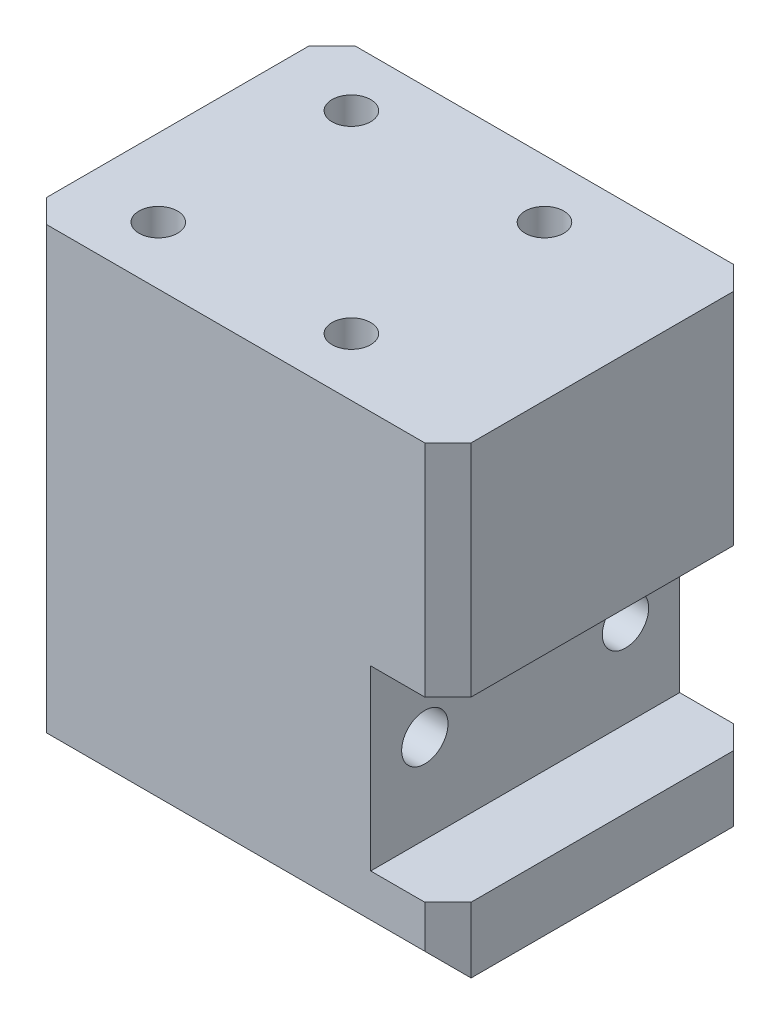
ISO-10303-21;
HEADER;
FILE_DESCRIPTION(('STEP AP214'),'2;1');
FILE_NAME('part.step','',(''),(''),'','','');
FILE_SCHEMA(('AUTOMOTIVE_DESIGN { 1 0 10303 214 1 1 1 1 }'));
ENDSEC;
DATA;
#1=APPLICATION_CONTEXT('core data for automotive mechanical design processes');
#2=APPLICATION_PROTOCOL_DEFINITION('international standard','automotive_design',2000,#1);
#3=PRODUCT_CONTEXT('',#1,'mechanical');
#4=PRODUCT('Part','Part','',(#3));
#5=PRODUCT_RELATED_PRODUCT_CATEGORY('part','',(#4));
#6=PRODUCT_DEFINITION_FORMATION('','',#4);
#7=PRODUCT_DEFINITION_CONTEXT('part definition',#1,'design');
#8=PRODUCT_DEFINITION('design','',#6,#7);
#9=PRODUCT_DEFINITION_SHAPE('','',#8);
#10=(LENGTH_UNIT() NAMED_UNIT(*) SI_UNIT(.MILLI.,.METRE.));
#11=(NAMED_UNIT(*) PLANE_ANGLE_UNIT() SI_UNIT($,.RADIAN.));
#12=(NAMED_UNIT(*) SI_UNIT($,.STERADIAN.) SOLID_ANGLE_UNIT());
#13=UNCERTAINTY_MEASURE_WITH_UNIT(LENGTH_MEASURE(1.E-05),#10,'distance_accuracy_value','');
#14=(GEOMETRIC_REPRESENTATION_CONTEXT(3) GLOBAL_UNCERTAINTY_ASSIGNED_CONTEXT((#13)) GLOBAL_UNIT_ASSIGNED_CONTEXT((#10,
#11,#12)) REPRESENTATION_CONTEXT('',''));
#15=CARTESIAN_POINT('',(0.,0.,0.));
#16=DIRECTION('',(0.,0.,1.));
#17=DIRECTION('',(1.,0.,0.));
#18=AXIS2_PLACEMENT_3D('',#15,#16,#17);
#19=CARTESIAN_POINT('',(11.25,20.,10.));
#20=DIRECTION('',(-1.,0.,0.));
#21=DIRECTION('',(0.,0.,1.));
#22=AXIS2_PLACEMENT_3D('',#19,#20,#21);
#23=PLANE('',#22);
#24=CARTESIAN_POINT('',(11.25,10.,-6.49604798854853));
#25=DIRECTION('',(1.,0.,0.));
#26=DIRECTION('',(0.,0.,-1.));
#27=AXIS2_PLACEMENT_3D('',#24,#25,#26);
#28=CIRCLE('',#27,1.5);
#29=CARTESIAN_POINT('',(11.25,10.,-7.99604798854853));
#30=VERTEX_POINT('',#29);
#31=EDGE_CURVE('E354',#30,#30,#28,.T.);
#32=ORIENTED_EDGE('',*,*,#31,.F.);
#33=EDGE_LOOP('',(#32));
#34=FACE_BOUND('',#33,.T.);
#35=CARTESIAN_POINT('',(11.25,10.,6.49604798854853));
#36=DIRECTION('',(1.,0.,0.));
#37=DIRECTION('',(0.,0.,-1.));
#38=AXIS2_PLACEMENT_3D('',#35,#36,#37);
#39=CIRCLE('',#38,1.5);
#40=CARTESIAN_POINT('',(11.25,10.,4.99604798854853));
#41=VERTEX_POINT('',#40);
#42=EDGE_CURVE('E349',#41,#41,#39,.T.);
#43=ORIENTED_EDGE('',*,*,#42,.F.);
#44=EDGE_LOOP('',(#43));
#45=FACE_BOUND('',#44,.T.);
#46=DIRECTION('',(0.,0.,1.));
#47=VECTOR('',#46,1.);
#48=CARTESIAN_POINT('',(11.25,4.25,-10.));
#49=LINE('',#48,#47);
#50=CARTESIAN_POINT('',(11.25,4.25,-10.));
#51=VERTEX_POINT('',#50);
#52=CARTESIAN_POINT('',(11.25,4.25,10.));
#53=VERTEX_POINT('',#52);
#54=EDGE_CURVE('E167',#51,#53,#49,.T.);
#55=ORIENTED_EDGE('',*,*,#54,.F.);
#56=DIRECTION('',(0.,-1.,0.));
#57=VECTOR('',#56,1.);
#58=CARTESIAN_POINT('',(11.25,20.,-10.));
#59=LINE('',#58,#57);
#60=CARTESIAN_POINT('',(11.25,15.75,-10.));
#61=VERTEX_POINT('',#60);
#62=EDGE_CURVE('E150',#61,#51,#59,.T.);
#63=ORIENTED_EDGE('',*,*,#62,.F.);
#64=DIRECTION('',(0.,0.,-1.));
#65=VECTOR('',#64,1.);
#66=CARTESIAN_POINT('',(11.25,15.75,-10.));
#67=LINE('',#66,#65);
#68=CARTESIAN_POINT('',(11.25,15.75,10.));
#69=VERTEX_POINT('',#68);
#70=EDGE_CURVE('E164',#69,#61,#67,.T.);
#71=ORIENTED_EDGE('',*,*,#70,.F.);
#72=DIRECTION('',(0.,-1.,0.));
#73=VECTOR('',#72,1.);
#74=CARTESIAN_POINT('',(11.25,20.,10.));
#75=LINE('',#74,#73);
#76=EDGE_CURVE('E169',#69,#53,#75,.T.);
#77=ORIENTED_EDGE('',*,*,#76,.T.);
#78=EDGE_LOOP('',(#55,#63,#71,#77));
#79=FACE_BOUND('',#78,.T.);
#80=ADVANCED_FACE('F39',(#34,#45,#79),#23,.F.);
#81=CARTESIAN_POINT('',(-11.25,20.,10.));
#82=DIRECTION('',(1.,0.,0.));
#83=DIRECTION('',(0.,0.,-1.));
#84=AXIS2_PLACEMENT_3D('',#81,#82,#83);
#85=PLANE('',#84);
#86=CARTESIAN_POINT('',(-11.25,10.,-6.49604798854853));
#87=DIRECTION('',(1.,0.,0.));
#88=DIRECTION('',(0.,0.,-1.));
#89=AXIS2_PLACEMENT_3D('',#86,#87,#88);
#90=CIRCLE('',#89,1.5);
#91=CARTESIAN_POINT('',(-11.25,10.,-7.99604798854853));
#92=VERTEX_POINT('',#91);
#93=EDGE_CURVE('E350',#92,#92,#90,.T.);
#94=ORIENTED_EDGE('',*,*,#93,.T.);
#95=EDGE_LOOP('',(#94));
#96=FACE_BOUND('',#95,.T.);
#97=CARTESIAN_POINT('',(-11.25,10.,6.49604798854853));
#98=DIRECTION('',(1.,0.,0.));
#99=DIRECTION('',(0.,0.,-1.));
#100=AXIS2_PLACEMENT_3D('',#97,#98,#99);
#101=CIRCLE('',#100,1.5);
#102=CARTESIAN_POINT('',(-11.25,10.,4.99604798854853));
#103=VERTEX_POINT('',#102);
#104=EDGE_CURVE('E358',#103,#103,#101,.T.);
#105=ORIENTED_EDGE('',*,*,#104,.T.);
#106=EDGE_LOOP('',(#105));
#107=FACE_BOUND('',#106,.T.);
#108=DIRECTION('',(0.,0.,1.));
#109=VECTOR('',#108,1.);
#110=CARTESIAN_POINT('',(-11.25,30.,-10.));
#111=LINE('',#110,#109);
#112=CARTESIAN_POINT('',(-11.25,30.,-8.49999999999998));
#113=VERTEX_POINT('',#112);
#114=CARTESIAN_POINT('',(-11.25,30.,8.49999999999998));
#115=VERTEX_POINT('',#114);
#116=EDGE_CURVE('E330',#113,#115,#111,.T.);
#117=ORIENTED_EDGE('',*,*,#116,.F.);
#118=DIRECTION('',(0.,-1.,0.));
#119=VECTOR('',#118,1.);
#120=CARTESIAN_POINT('',(-11.25,20.,-8.49999999999998));
#121=LINE('',#120,#119);
#122=CARTESIAN_POINT('',(-11.25,1.50000000000002,-8.49999999999998));
#123=VERTEX_POINT('',#122);
#124=EDGE_CURVE('E11',#113,#123,#121,.T.);
#125=ORIENTED_EDGE('',*,*,#124,.T.);
#126=DIRECTION('',(0.,0.,1.));
#127=VECTOR('',#126,1.);
#128=CARTESIAN_POINT('',(-11.25,1.50000000000002,10.));
#129=LINE('',#128,#127);
#130=CARTESIAN_POINT('',(-11.25,1.50000000000002,8.49999999999999));
#131=VERTEX_POINT('',#130);
#132=EDGE_CURVE('E49',#123,#131,#129,.T.);
#133=ORIENTED_EDGE('',*,*,#132,.T.);
#134=DIRECTION('',(0.,1.,0.));
#135=VECTOR('',#134,1.);
#136=CARTESIAN_POINT('',(-11.25,20.,8.49999999999999));
#137=LINE('',#136,#135);
#138=EDGE_CURVE('E258',#131,#115,#137,.T.);
#139=ORIENTED_EDGE('',*,*,#138,.T.);
#140=EDGE_LOOP('',(#117,#125,#133,#139));
#141=FACE_BOUND('',#140,.T.);
#142=ADVANCED_FACE('F412',(#96,#107,#141),#85,.F.);
#143=CARTESIAN_POINT('',(11.25,20.,10.));
#144=DIRECTION('',(0.,0.,-1.));
#145=DIRECTION('',(-1.,0.,0.));
#146=AXIS2_PLACEMENT_3D('',#143,#144,#145);
#147=PLANE('',#146);
#148=DIRECTION('',(-1.,0.,0.));
#149=VECTOR('',#148,1.);
#150=CARTESIAN_POINT('',(16.25,15.75,10.));
#151=LINE('',#150,#149);
#152=CARTESIAN_POINT('',(14.75,15.75,10.));
#153=VERTEX_POINT('',#152);
#154=EDGE_CURVE('E157',#153,#69,#151,.T.);
#155=ORIENTED_EDGE('',*,*,#154,.F.);
#156=DIRECTION('',(0.,1.,0.));
#157=VECTOR('',#156,1.);
#158=CARTESIAN_POINT('',(14.75,30.,10.));
#159=LINE('',#158,#157);
#160=CARTESIAN_POINT('',(14.75,30.,10.));
#161=VERTEX_POINT('',#160);
#162=EDGE_CURVE('E233',#153,#161,#159,.T.);
#163=ORIENTED_EDGE('',*,*,#162,.T.);
#164=DIRECTION('',(1.,0.,0.));
#165=VECTOR('',#164,1.);
#166=CARTESIAN_POINT('',(16.25,30.,10.));
#167=LINE('',#166,#165);
#168=CARTESIAN_POINT('',(-9.74999999999999,30.,10.));
#169=VERTEX_POINT('',#168);
#170=EDGE_CURVE('E337',#169,#161,#167,.T.);
#171=ORIENTED_EDGE('',*,*,#170,.F.);
#172=DIRECTION('',(0.,-1.,0.));
#173=VECTOR('',#172,1.);
#174=CARTESIAN_POINT('',(-9.74999999999999,20.,10.));
#175=LINE('',#174,#173);
#176=CARTESIAN_POINT('',(-9.74999999999999,1.50000000000001,10.));
#177=VERTEX_POINT('',#176);
#178=EDGE_CURVE('E224',#169,#177,#175,.T.);
#179=ORIENTED_EDGE('',*,*,#178,.T.);
#180=DIRECTION('',(1.,0.,0.));
#181=VECTOR('',#180,1.);
#182=CARTESIAN_POINT('',(11.25,1.50000000000001,10.));
#183=LINE('',#182,#181);
#184=CARTESIAN_POINT('',(14.75,1.50000000000001,10.));
#185=VERTEX_POINT('',#184);
#186=EDGE_CURVE('E227',#177,#185,#183,.T.);
#187=ORIENTED_EDGE('',*,*,#186,.T.);
#188=DIRECTION('',(0.,1.,0.));
#189=VECTOR('',#188,1.);
#190=CARTESIAN_POINT('',(14.75,20.,10.));
#191=LINE('',#190,#189);
#192=CARTESIAN_POINT('',(14.75,4.25,10.));
#193=VERTEX_POINT('',#192);
#194=EDGE_CURVE('E230',#185,#193,#191,.T.);
#195=ORIENTED_EDGE('',*,*,#194,.T.);
#196=DIRECTION('',(-1.,0.,0.));
#197=VECTOR('',#196,1.);
#198=CARTESIAN_POINT('',(16.25,4.25,10.));
#199=LINE('',#198,#197);
#200=EDGE_CURVE('E180',#193,#53,#199,.T.);
#201=ORIENTED_EDGE('',*,*,#200,.T.);
#202=ORIENTED_EDGE('',*,*,#76,.F.);
#203=EDGE_LOOP('',(#155,#163,#171,#179,#187,#195,#201,#202));
#204=FACE_BOUND('',#203,.T.);
#205=ADVANCED_FACE('F378',(#204),#147,.F.);
#206=CARTESIAN_POINT('',(11.25,20.,-10.));
#207=DIRECTION('',(0.,0.,1.));
#208=DIRECTION('',(1.,0.,0.));
#209=AXIS2_PLACEMENT_3D('',#206,#207,#208);
#210=PLANE('',#209);
#211=DIRECTION('',(-1.,0.,0.));
#212=VECTOR('',#211,1.);
#213=CARTESIAN_POINT('',(16.25,30.,-10.));
#214=LINE('',#213,#212);
#215=CARTESIAN_POINT('',(14.75,30.,-10.));
#216=VERTEX_POINT('',#215);
#217=CARTESIAN_POINT('',(-9.74999999999999,30.,-10.));
#218=VERTEX_POINT('',#217);
#219=EDGE_CURVE('E345',#216,#218,#214,.T.);
#220=ORIENTED_EDGE('',*,*,#219,.F.);
#221=DIRECTION('',(0.,-1.,0.));
#222=VECTOR('',#221,1.);
#223=CARTESIAN_POINT('',(14.75,15.75,-10.));
#224=LINE('',#223,#222);
#225=CARTESIAN_POINT('',(14.75,15.75,-10.));
#226=VERTEX_POINT('',#225);
#227=EDGE_CURVE('E152',#216,#226,#224,.T.);
#228=ORIENTED_EDGE('',*,*,#227,.T.);
#229=DIRECTION('',(-1.,0.,0.));
#230=VECTOR('',#229,1.);
#231=CARTESIAN_POINT('',(16.25,15.75,-10.));
#232=LINE('',#231,#230);
#233=EDGE_CURVE('E145',#226,#61,#232,.T.);
#234=ORIENTED_EDGE('',*,*,#233,.T.);
#235=ORIENTED_EDGE('',*,*,#62,.T.);
#236=DIRECTION('',(-1.,0.,0.));
#237=VECTOR('',#236,1.);
#238=CARTESIAN_POINT('',(16.25,4.25,-10.));
#239=LINE('',#238,#237);
#240=CARTESIAN_POINT('',(14.75,4.25,-10.));
#241=VERTEX_POINT('',#240);
#242=EDGE_CURVE('E174',#241,#51,#239,.T.);
#243=ORIENTED_EDGE('',*,*,#242,.F.);
#244=DIRECTION('',(0.,-1.,0.));
#245=VECTOR('',#244,1.);
#246=CARTESIAN_POINT('',(14.75,20.,-10.));
#247=LINE('',#246,#245);
#248=CARTESIAN_POINT('',(14.75,1.50000000000001,-10.));
#249=VERTEX_POINT('',#248);
#250=EDGE_CURVE('E213',#241,#249,#247,.T.);
#251=ORIENTED_EDGE('',*,*,#250,.T.);
#252=DIRECTION('',(-1.,0.,0.));
#253=VECTOR('',#252,1.);
#254=CARTESIAN_POINT('',(11.25,1.50000000000001,-10.));
#255=LINE('',#254,#253);
#256=CARTESIAN_POINT('',(-9.74999999999999,1.50000000000001,-10.));
#257=VERTEX_POINT('',#256);
#258=EDGE_CURVE('E210',#249,#257,#255,.T.);
#259=ORIENTED_EDGE('',*,*,#258,.T.);
#260=DIRECTION('',(0.,1.,0.));
#261=VECTOR('',#260,1.);
#262=CARTESIAN_POINT('',(-9.74999999999999,20.,-10.));
#263=LINE('',#262,#261);
#264=EDGE_CURVE('E207',#257,#218,#263,.T.);
#265=ORIENTED_EDGE('',*,*,#264,.T.);
#266=EDGE_LOOP('',(#220,#228,#234,#235,#243,#251,#259,#265));
#267=FACE_BOUND('',#266,.T.);
#268=ADVANCED_FACE('F148',(#267),#210,.F.);
#269=CARTESIAN_POINT('',(0.,0.,0.));
#270=DIRECTION('',(0.,1.,0.));
#271=DIRECTION('',(0.,0.,1.));
#272=AXIS2_PLACEMENT_3D('',#269,#270,#271);
#273=PLANE('',#272);
#274=DIRECTION('',(0.,0.,-1.));
#275=VECTOR('',#274,1.);
#276=CARTESIAN_POINT('',(-9.74999999999999,0.,0.));
#277=LINE('',#276,#275);
#278=CARTESIAN_POINT('',(-9.74999999999999,0.,8.49999999999999));
#279=VERTEX_POINT('',#278);
#280=CARTESIAN_POINT('',(-9.74999999999999,0.,-8.49999999999998));
#281=VERTEX_POINT('',#280);
#282=EDGE_CURVE('E252',#279,#281,#277,.T.);
#283=ORIENTED_EDGE('',*,*,#282,.T.);
#284=DIRECTION('',(1.,0.,0.));
#285=VECTOR('',#284,1.);
#286=CARTESIAN_POINT('',(0.,0.,-8.49999999999999));
#287=LINE('',#286,#285);
#288=CARTESIAN_POINT('',(16.25,0.,-8.49999999999999));
#289=VERTEX_POINT('',#288);
#290=EDGE_CURVE('E255',#281,#289,#287,.T.);
#291=ORIENTED_EDGE('',*,*,#290,.T.);
#292=DIRECTION('',(0.,0.,-1.));
#293=VECTOR('',#292,1.);
#294=CARTESIAN_POINT('',(16.25,0.,-10.));
#295=LINE('',#294,#293);
#296=CARTESIAN_POINT('',(16.25,0.,8.49999999999999));
#297=VERTEX_POINT('',#296);
#298=EDGE_CURVE('E369',#297,#289,#295,.T.);
#299=ORIENTED_EDGE('',*,*,#298,.F.);
#300=DIRECTION('',(-1.,0.,0.));
#301=VECTOR('',#300,1.);
#302=CARTESIAN_POINT('',(0.,0.,8.49999999999999));
#303=LINE('',#302,#301);
#304=EDGE_CURVE('E249',#297,#279,#303,.T.);
#305=ORIENTED_EDGE('',*,*,#304,.T.);
#306=EDGE_LOOP('',(#283,#291,#299,#305));
#307=FACE_BOUND('',#306,.T.);
#308=ADVANCED_FACE('F455',(#307),#273,.F.);
#309=CARTESIAN_POINT('',(16.25,15.75,-10.));
#310=DIRECTION('',(0.,1.,0.));
#311=DIRECTION('',(0.,0.,1.));
#312=AXIS2_PLACEMENT_3D('',#309,#310,#311);
#313=PLANE('',#312);
#314=ORIENTED_EDGE('',*,*,#233,.F.);
#315=DIRECTION('',(0.707106781186549,0.,0.707106781186546));
#316=VECTOR('',#315,1.);
#317=CARTESIAN_POINT('',(16.25,15.75,-8.49999999999999));
#318=LINE('',#317,#316);
#319=CARTESIAN_POINT('',(16.25,15.75,-8.5));
#320=VERTEX_POINT('',#319);
#321=EDGE_CURVE('E221',#226,#320,#318,.T.);
#322=ORIENTED_EDGE('',*,*,#321,.T.);
#323=DIRECTION('',(0.,0.,-1.));
#324=VECTOR('',#323,1.);
#325=CARTESIAN_POINT('',(16.25,15.75,-10.));
#326=LINE('',#325,#324);
#327=CARTESIAN_POINT('',(16.25,15.75,8.49999999999999));
#328=VERTEX_POINT('',#327);
#329=EDGE_CURVE('E158',#328,#320,#326,.T.);
#330=ORIENTED_EDGE('',*,*,#329,.F.);
#331=DIRECTION('',(-0.707106781186549,0.,0.707106781186546));
#332=VECTOR('',#331,1.);
#333=CARTESIAN_POINT('',(16.25,15.75,8.49999999999999));
#334=LINE('',#333,#332);
#335=EDGE_CURVE('E218',#328,#153,#334,.T.);
#336=ORIENTED_EDGE('',*,*,#335,.T.);
#337=ORIENTED_EDGE('',*,*,#154,.T.);
#338=ORIENTED_EDGE('',*,*,#70,.T.);
#339=EDGE_LOOP('',(#314,#322,#330,#336,#337,#338));
#340=FACE_BOUND('',#339,.T.);
#341=ADVANCED_FACE('F171',(#340),#313,.F.);
#342=CARTESIAN_POINT('',(16.25,0.,0.));
#343=DIRECTION('',(1.,0.,0.));
#344=DIRECTION('',(0.,0.,-1.));
#345=AXIS2_PLACEMENT_3D('',#342,#343,#344);
#346=PLANE('',#345);
#347=ORIENTED_EDGE('',*,*,#329,.T.);
#348=DIRECTION('',(0.,1.,0.));
#349=VECTOR('',#348,1.);
#350=CARTESIAN_POINT('',(16.25,30.,-8.5));
#351=LINE('',#350,#349);
#352=CARTESIAN_POINT('',(16.25,30.,-8.5));
#353=VERTEX_POINT('',#352);
#354=EDGE_CURVE('E191',#320,#353,#351,.T.);
#355=ORIENTED_EDGE('',*,*,#354,.T.);
#356=DIRECTION('',(0.,0.,-1.));
#357=VECTOR('',#356,1.);
#358=CARTESIAN_POINT('',(16.25,30.,-10.));
#359=LINE('',#358,#357);
#360=CARTESIAN_POINT('',(16.25,30.,8.49999999999999));
#361=VERTEX_POINT('',#360);
#362=EDGE_CURVE('E341',#361,#353,#359,.T.);
#363=ORIENTED_EDGE('',*,*,#362,.F.);
#364=DIRECTION('',(0.,-1.,0.));
#365=VECTOR('',#364,1.);
#366=CARTESIAN_POINT('',(16.25,15.75,8.49999999999999));
#367=LINE('',#366,#365);
#368=EDGE_CURVE('E187',#361,#328,#367,.T.);
#369=ORIENTED_EDGE('',*,*,#368,.T.);
#370=EDGE_LOOP('',(#347,#355,#363,#369));
#371=FACE_BOUND('',#370,.T.);
#372=ADVANCED_FACE('F421',(#371),#346,.T.);
#373=CARTESIAN_POINT('',(16.25,4.25,-10.));
#374=DIRECTION('',(0.,-1.,0.));
#375=DIRECTION('',(0.,0.,-1.));
#376=AXIS2_PLACEMENT_3D('',#373,#374,#375);
#377=PLANE('',#376);
#378=DIRECTION('',(0.,0.,1.));
#379=VECTOR('',#378,1.);
#380=CARTESIAN_POINT('',(16.25,4.25,-10.));
#381=LINE('',#380,#379);
#382=CARTESIAN_POINT('',(16.25,4.25,-8.49999999999999));
#383=VERTEX_POINT('',#382);
#384=CARTESIAN_POINT('',(16.25,4.25,8.49999999999999));
#385=VERTEX_POINT('',#384);
#386=EDGE_CURVE('E365',#383,#385,#381,.T.);
#387=ORIENTED_EDGE('',*,*,#386,.F.);
#388=DIRECTION('',(0.707106781186549,0.,0.707106781186546));
#389=VECTOR('',#388,1.);
#390=CARTESIAN_POINT('',(16.25,4.25,-8.49999999999999));
#391=LINE('',#390,#389);
#392=EDGE_CURVE('E246',#383,#241,#391,.F.);
#393=ORIENTED_EDGE('',*,*,#392,.T.);
#394=ORIENTED_EDGE('',*,*,#242,.T.);
#395=ORIENTED_EDGE('',*,*,#54,.T.);
#396=ORIENTED_EDGE('',*,*,#200,.F.);
#397=DIRECTION('',(-0.707106781186546,0.,0.707106781186549));
#398=VECTOR('',#397,1.);
#399=CARTESIAN_POINT('',(16.25,4.25,8.49999999999999));
#400=LINE('',#399,#398);
#401=EDGE_CURVE('E243',#193,#385,#400,.F.);
#402=ORIENTED_EDGE('',*,*,#401,.T.);
#403=EDGE_LOOP('',(#387,#393,#394,#395,#396,#402));
#404=FACE_BOUND('',#403,.T.);
#405=ADVANCED_FACE('F383',(#404),#377,.F.);
#406=CARTESIAN_POINT('',(16.25,0.,0.));
#407=DIRECTION('',(-1.,0.,0.));
#408=DIRECTION('',(0.,0.,1.));
#409=AXIS2_PLACEMENT_3D('',#406,#407,#408);
#410=PLANE('',#409);
#411=ORIENTED_EDGE('',*,*,#298,.T.);
#412=DIRECTION('',(0.,1.,0.));
#413=VECTOR('',#412,1.);
#414=CARTESIAN_POINT('',(16.25,0.,-8.49999999999999));
#415=LINE('',#414,#413);
#416=EDGE_CURVE('E239',#289,#383,#415,.T.);
#417=ORIENTED_EDGE('',*,*,#416,.T.);
#418=ORIENTED_EDGE('',*,*,#386,.T.);
#419=DIRECTION('',(0.,-1.,0.));
#420=VECTOR('',#419,1.);
#421=CARTESIAN_POINT('',(16.25,0.,8.49999999999999));
#422=LINE('',#421,#420);
#423=EDGE_CURVE('E236',#385,#297,#422,.T.);
#424=ORIENTED_EDGE('',*,*,#423,.T.);
#425=EDGE_LOOP('',(#411,#417,#418,#424));
#426=FACE_BOUND('',#425,.T.);
#427=ADVANCED_FACE('F469',(#426),#410,.F.);
#428=CARTESIAN_POINT('',(-11.25,10.,6.49604798854853));
#429=DIRECTION('',(1.,0.,0.));
#430=DIRECTION('',(0.,0.,-1.));
#431=AXIS2_PLACEMENT_3D('',#428,#429,#430);
#432=CYLINDRICAL_SURFACE('',#431,1.5);
#433=CARTESIAN_POINT('',(-11.25,10.,4.99604798854853));
#434=CARTESIAN_POINT('',(-11.015625,10.,4.99604798854853));
#435=CARTESIAN_POINT('',(-10.78125,10.,4.99604798854853));
#436=CARTESIAN_POINT('',(-10.3125,10.,4.99604798854853));
#437=CARTESIAN_POINT('',(-10.078125,10.,4.99604798854853));
#438=CARTESIAN_POINT('',(-9.609375,10.,4.99604798854853));
#439=CARTESIAN_POINT('',(-9.375,10.,4.99604798854853));
#440=CARTESIAN_POINT('',(-8.90625,10.,4.99604798854853));
#441=CARTESIAN_POINT('',(-8.671875,10.,4.99604798854853));
#442=CARTESIAN_POINT('',(-8.203125,10.,4.99604798854853));
#443=CARTESIAN_POINT('',(-7.96875,10.,4.99604798854853));
#444=CARTESIAN_POINT('',(-7.5,10.,4.99604798854853));
#445=CARTESIAN_POINT('',(-7.265625,10.,4.99604798854853));
#446=CARTESIAN_POINT('',(-6.796875,10.,4.99604798854853));
#447=CARTESIAN_POINT('',(-6.5625,10.,4.99604798854853));
#448=CARTESIAN_POINT('',(-6.09375,10.,4.99604798854853));
#449=CARTESIAN_POINT('',(-5.859375,10.,4.99604798854853));
#450=CARTESIAN_POINT('',(-5.390625,10.,4.99604798854853));
#451=CARTESIAN_POINT('',(-5.15625,10.,4.99604798854853));
#452=CARTESIAN_POINT('',(-4.6875,10.,4.99604798854853));
#453=CARTESIAN_POINT('',(-4.453125,10.,4.99604798854853));
#454=CARTESIAN_POINT('',(-3.984375,10.,4.99604798854853));
#455=CARTESIAN_POINT('',(-3.75,10.,4.99604798854853));
#456=CARTESIAN_POINT('',(-3.28125,10.,4.99604798854853));
#457=CARTESIAN_POINT('',(-3.046875,10.,4.99604798854853));
#458=CARTESIAN_POINT('',(-2.578125,10.,4.99604798854853));
#459=CARTESIAN_POINT('',(-2.34375,10.,4.99604798854853));
#460=CARTESIAN_POINT('',(-1.875,10.,4.99604798854853));
#461=CARTESIAN_POINT('',(-1.640625,10.,4.99604798854853));
#462=CARTESIAN_POINT('',(-1.171875,10.,4.99604798854853));
#463=CARTESIAN_POINT('',(-0.9375,10.,4.99604798854853));
#464=CARTESIAN_POINT('',(-0.46875,10.,4.99604798854853));
#465=CARTESIAN_POINT('',(-0.234375,10.,4.99604798854853));
#466=CARTESIAN_POINT('',(0.234375,10.,4.99604798854853));
#467=CARTESIAN_POINT('',(0.46875,10.,4.99604798854853));
#468=CARTESIAN_POINT('',(0.9375,10.,4.99604798854853));
#469=CARTESIAN_POINT('',(1.171875,10.,4.99604798854853));
#470=CARTESIAN_POINT('',(1.640625,10.,4.99604798854853));
#471=CARTESIAN_POINT('',(1.875,10.,4.99604798854853));
#472=CARTESIAN_POINT('',(2.34375,10.,4.99604798854853));
#473=CARTESIAN_POINT('',(2.578125,10.,4.99604798854853));
#474=CARTESIAN_POINT('',(3.046875,10.,4.99604798854853));
#475=CARTESIAN_POINT('',(3.28125,10.,4.99604798854853));
#476=CARTESIAN_POINT('',(3.75,10.,4.99604798854853));
#477=CARTESIAN_POINT('',(3.984375,10.,4.99604798854853));
#478=CARTESIAN_POINT('',(4.453125,10.,4.99604798854853));
#479=CARTESIAN_POINT('',(4.6875,10.,4.99604798854853));
#480=CARTESIAN_POINT('',(5.15625,10.,4.99604798854853));
#481=CARTESIAN_POINT('',(5.390625,10.,4.99604798854853));
#482=CARTESIAN_POINT('',(5.859375,10.,4.99604798854853));
#483=CARTESIAN_POINT('',(6.09375,10.,4.99604798854853));
#484=CARTESIAN_POINT('',(6.5625,10.,4.99604798854853));
#485=CARTESIAN_POINT('',(6.796875,10.,4.99604798854853));
#486=CARTESIAN_POINT('',(7.265625,10.,4.99604798854853));
#487=CARTESIAN_POINT('',(7.5,10.,4.99604798854853));
#488=CARTESIAN_POINT('',(7.96875,10.,4.99604798854853));
#489=CARTESIAN_POINT('',(8.203125,10.,4.99604798854853));
#490=CARTESIAN_POINT('',(8.671875,10.,4.99604798854853));
#491=CARTESIAN_POINT('',(8.90625,10.,4.99604798854853));
#492=CARTESIAN_POINT('',(9.375,10.,4.99604798854853));
#493=CARTESIAN_POINT('',(9.609375,10.,4.99604798854853));
#494=CARTESIAN_POINT('',(10.078125,10.,4.99604798854853));
#495=CARTESIAN_POINT('',(10.3125,10.,4.99604798854853));
#496=CARTESIAN_POINT('',(10.78125,10.,4.99604798854853));
#497=CARTESIAN_POINT('',(11.015625,10.,4.99604798854853));
#498=CARTESIAN_POINT('',(11.25,10.,4.99604798854853));
#499=B_SPLINE_CURVE_WITH_KNOTS('',3,(#433,#434,#435,#436,#437,#438,#439,#440,#441,#442,#443,
#444,#445,#446,#447,#448,#449,#450,#451,#452,#453,#454,#455,#456,#457,#458,#459,#460,#461,#462,
#463,#464,#465,#466,#467,#468,#469,#470,#471,#472,#473,#474,#475,#476,#477,#478,#479,#480,#481,
#482,#483,#484,#485,#486,#487,#488,#489,#490,#491,#492,#493,#494,#495,#496,#497,#498),
.UNSPECIFIED.,.F.,.F.,(4,2,2,2,2,2,2,2,2,2,2,2,2,2,2,2,2,2,2,2,2,2,2,2,2,2,2,2,2,2,2,2,4),(0.,
0.703125000000001,1.40625,2.109375,2.8125,3.515625,4.21875,4.921875,5.625,6.328125,7.03125,
7.734375,8.4375,9.140625,9.84375,10.546875,11.25,11.953125,12.65625,13.359375,14.0625,14.765625,
15.46875,16.171875,16.875,17.578125,18.28125,18.984375,19.6875,20.390625,21.09375,21.796875,
22.5),.UNSPECIFIED.);
#500=EDGE_CURVE('BSEAM472',#103,#41,#499,.T.);
#501=ORIENTED_EDGE('',*,*,#104,.F.);
#502=ORIENTED_EDGE('',*,*,#42,.T.);
#503=ORIENTED_EDGE('',*,*,#500,.T.);
#504=ORIENTED_EDGE('',*,*,#500,.F.);
#505=EDGE_LOOP('',(#501,#503,#502,#504));
#506=FACE_BOUND('',#505,.T.);
#507=ADVANCED_FACE('F472',(#506),#432,.F.);
#508=CARTESIAN_POINT('',(-11.25,10.,-6.49604798854853));
#509=DIRECTION('',(1.,0.,0.));
#510=DIRECTION('',(0.,0.,-1.));
#511=AXIS2_PLACEMENT_3D('',#508,#509,#510);
#512=CYLINDRICAL_SURFACE('',#511,1.5);
#513=CARTESIAN_POINT('',(-11.25,10.,-7.99604798854853));
#514=CARTESIAN_POINT('',(-11.015625,10.,-7.99604798854853));
#515=CARTESIAN_POINT('',(-10.78125,10.,-7.99604798854853));
#516=CARTESIAN_POINT('',(-10.3125,10.,-7.99604798854853));
#517=CARTESIAN_POINT('',(-10.078125,10.,-7.99604798854853));
#518=CARTESIAN_POINT('',(-9.609375,10.,-7.99604798854853));
#519=CARTESIAN_POINT('',(-9.375,10.,-7.99604798854853));
#520=CARTESIAN_POINT('',(-8.90625,10.,-7.99604798854853));
#521=CARTESIAN_POINT('',(-8.671875,10.,-7.99604798854853));
#522=CARTESIAN_POINT('',(-8.203125,10.,-7.99604798854853));
#523=CARTESIAN_POINT('',(-7.96875,10.,-7.99604798854853));
#524=CARTESIAN_POINT('',(-7.5,10.,-7.99604798854853));
#525=CARTESIAN_POINT('',(-7.265625,10.,-7.99604798854853));
#526=CARTESIAN_POINT('',(-6.796875,10.,-7.99604798854853));
#527=CARTESIAN_POINT('',(-6.5625,10.,-7.99604798854853));
#528=CARTESIAN_POINT('',(-6.09375,10.,-7.99604798854853));
#529=CARTESIAN_POINT('',(-5.859375,10.,-7.99604798854853));
#530=CARTESIAN_POINT('',(-5.390625,10.,-7.99604798854853));
#531=CARTESIAN_POINT('',(-5.15625,10.,-7.99604798854853));
#532=CARTESIAN_POINT('',(-4.6875,10.,-7.99604798854853));
#533=CARTESIAN_POINT('',(-4.453125,10.,-7.99604798854853));
#534=CARTESIAN_POINT('',(-3.984375,10.,-7.99604798854853));
#535=CARTESIAN_POINT('',(-3.75,10.,-7.99604798854853));
#536=CARTESIAN_POINT('',(-3.28125,10.,-7.99604798854853));
#537=CARTESIAN_POINT('',(-3.046875,10.,-7.99604798854853));
#538=CARTESIAN_POINT('',(-2.578125,10.,-7.99604798854853));
#539=CARTESIAN_POINT('',(-2.34375,10.,-7.99604798854853));
#540=CARTESIAN_POINT('',(-1.875,10.,-7.99604798854853));
#541=CARTESIAN_POINT('',(-1.640625,10.,-7.99604798854853));
#542=CARTESIAN_POINT('',(-1.171875,10.,-7.99604798854853));
#543=CARTESIAN_POINT('',(-0.9375,10.,-7.99604798854853));
#544=CARTESIAN_POINT('',(-0.46875,10.,-7.99604798854853));
#545=CARTESIAN_POINT('',(-0.234375,10.,-7.99604798854853));
#546=CARTESIAN_POINT('',(0.234375,10.,-7.99604798854853));
#547=CARTESIAN_POINT('',(0.46875,10.,-7.99604798854853));
#548=CARTESIAN_POINT('',(0.9375,10.,-7.99604798854853));
#549=CARTESIAN_POINT('',(1.171875,10.,-7.99604798854853));
#550=CARTESIAN_POINT('',(1.640625,10.,-7.99604798854853));
#551=CARTESIAN_POINT('',(1.875,10.,-7.99604798854853));
#552=CARTESIAN_POINT('',(2.34375,10.,-7.99604798854853));
#553=CARTESIAN_POINT('',(2.578125,10.,-7.99604798854853));
#554=CARTESIAN_POINT('',(3.046875,10.,-7.99604798854853));
#555=CARTESIAN_POINT('',(3.28125,10.,-7.99604798854853));
#556=CARTESIAN_POINT('',(3.75,10.,-7.99604798854853));
#557=CARTESIAN_POINT('',(3.984375,10.,-7.99604798854853));
#558=CARTESIAN_POINT('',(4.453125,10.,-7.99604798854853));
#559=CARTESIAN_POINT('',(4.6875,10.,-7.99604798854853));
#560=CARTESIAN_POINT('',(5.15625,10.,-7.99604798854853));
#561=CARTESIAN_POINT('',(5.390625,10.,-7.99604798854853));
#562=CARTESIAN_POINT('',(5.859375,10.,-7.99604798854853));
#563=CARTESIAN_POINT('',(6.09375,10.,-7.99604798854853));
#564=CARTESIAN_POINT('',(6.5625,10.,-7.99604798854853));
#565=CARTESIAN_POINT('',(6.796875,10.,-7.99604798854853));
#566=CARTESIAN_POINT('',(7.265625,10.,-7.99604798854853));
#567=CARTESIAN_POINT('',(7.5,10.,-7.99604798854853));
#568=CARTESIAN_POINT('',(7.96875,10.,-7.99604798854853));
#569=CARTESIAN_POINT('',(8.203125,10.,-7.99604798854853));
#570=CARTESIAN_POINT('',(8.671875,10.,-7.99604798854853));
#571=CARTESIAN_POINT('',(8.90625,10.,-7.99604798854853));
#572=CARTESIAN_POINT('',(9.375,10.,-7.99604798854853));
#573=CARTESIAN_POINT('',(9.609375,10.,-7.99604798854853));
#574=CARTESIAN_POINT('',(10.078125,10.,-7.99604798854853));
#575=CARTESIAN_POINT('',(10.3125,10.,-7.99604798854853));
#576=CARTESIAN_POINT('',(10.78125,10.,-7.99604798854853));
#577=CARTESIAN_POINT('',(11.015625,10.,-7.99604798854853));
#578=CARTESIAN_POINT('',(11.25,10.,-7.99604798854853));
#579=B_SPLINE_CURVE_WITH_KNOTS('',3,(#513,#514,#515,#516,#517,#518,#519,#520,#521,#522,#523,
#524,#525,#526,#527,#528,#529,#530,#531,#532,#533,#534,#535,#536,#537,#538,#539,#540,#541,#542,
#543,#544,#545,#546,#547,#548,#549,#550,#551,#552,#553,#554,#555,#556,#557,#558,#559,#560,#561,
#562,#563,#564,#565,#566,#567,#568,#569,#570,#571,#572,#573,#574,#575,#576,#577,#578),
.UNSPECIFIED.,.F.,.F.,(4,2,2,2,2,2,2,2,2,2,2,2,2,2,2,2,2,2,2,2,2,2,2,2,2,2,2,2,2,2,2,2,4),(0.,
0.703125000000001,1.40625,2.109375,2.8125,3.515625,4.21875,4.921875,5.625,6.328125,7.03125,
7.734375,8.4375,9.140625,9.84375,10.546875,11.25,11.953125,12.65625,13.359375,14.0625,14.765625,
15.46875,16.171875,16.875,17.578125,18.28125,18.984375,19.6875,20.390625,21.09375,21.796875,
22.5),.UNSPECIFIED.);
#580=EDGE_CURVE('BSEAM476',#92,#30,#579,.T.);
#581=ORIENTED_EDGE('',*,*,#93,.F.);
#582=ORIENTED_EDGE('',*,*,#31,.T.);
#583=ORIENTED_EDGE('',*,*,#580,.T.);
#584=ORIENTED_EDGE('',*,*,#580,.F.);
#585=EDGE_LOOP('',(#581,#583,#582,#584));
#586=FACE_BOUND('',#585,.T.);
#587=ADVANCED_FACE('F476',(#586),#512,.F.);
#588=CARTESIAN_POINT('',(0.,30.,0.));
#589=DIRECTION('',(0.,-1.,0.));
#590=DIRECTION('',(0.,0.,-1.));
#591=AXIS2_PLACEMENT_3D('',#588,#589,#590);
#592=PLANE('',#591);
#593=CARTESIAN_POINT('',(6.25000000000001,30.,6.25));
#594=DIRECTION('',(0.,1.,0.));
#595=DIRECTION('',(0.,0.,1.));
#596=AXIS2_PLACEMENT_3D('',#593,#594,#595);
#597=CIRCLE('',#596,1.25);
#598=CARTESIAN_POINT('',(6.25000000000001,30.,7.5));
#599=VERTEX_POINT('',#598);
#600=EDGE_CURVE('E315',#599,#599,#597,.T.);
#601=ORIENTED_EDGE('',*,*,#600,.F.);
#602=EDGE_LOOP('',(#601));
#603=FACE_BOUND('',#602,.T.);
#604=CARTESIAN_POINT('',(-6.25,30.,-6.25));
#605=DIRECTION('',(0.,1.,0.));
#606=DIRECTION('',(0.,0.,1.));
#607=AXIS2_PLACEMENT_3D('',#604,#605,#606);
#608=CIRCLE('',#607,1.25);
#609=CARTESIAN_POINT('',(-6.25,30.,-5.));
#610=VERTEX_POINT('',#609);
#611=EDGE_CURVE('E307',#610,#610,#608,.T.);
#612=ORIENTED_EDGE('',*,*,#611,.F.);
#613=EDGE_LOOP('',(#612));
#614=FACE_BOUND('',#613,.T.);
#615=CARTESIAN_POINT('',(-6.25,30.,6.25));
#616=DIRECTION('',(0.,1.,0.));
#617=DIRECTION('',(0.,0.,1.));
#618=AXIS2_PLACEMENT_3D('',#615,#616,#617);
#619=CIRCLE('',#618,1.25);
#620=CARTESIAN_POINT('',(-6.25,30.,7.5));
#621=VERTEX_POINT('',#620);
#622=EDGE_CURVE('E294',#621,#621,#619,.T.);
#623=ORIENTED_EDGE('',*,*,#622,.F.);
#624=EDGE_LOOP('',(#623));
#625=FACE_BOUND('',#624,.T.);
#626=CARTESIAN_POINT('',(6.25,30.,-6.25));
#627=DIRECTION('',(0.,1.,0.));
#628=DIRECTION('',(0.,0.,1.));
#629=AXIS2_PLACEMENT_3D('',#626,#627,#628);
#630=CIRCLE('',#629,1.25);
#631=CARTESIAN_POINT('',(6.25,30.,-5.));
#632=VERTEX_POINT('',#631);
#633=EDGE_CURVE('E314',#632,#632,#630,.T.);
#634=ORIENTED_EDGE('',*,*,#633,.F.);
#635=EDGE_LOOP('',(#634));
#636=FACE_BOUND('',#635,.T.);
#637=ORIENTED_EDGE('',*,*,#362,.T.);
#638=DIRECTION('',(-0.707106781186549,0.,-0.707106781186546));
#639=VECTOR('',#638,1.);
#640=CARTESIAN_POINT('',(16.25,30.,-8.5));
#641=LINE('',#640,#639);
#642=EDGE_CURVE('E204',#353,#216,#641,.T.);
#643=ORIENTED_EDGE('',*,*,#642,.T.);
#644=ORIENTED_EDGE('',*,*,#219,.T.);
#645=DIRECTION('',(0.707106781186546,0.,-0.707106781186549));
#646=VECTOR('',#645,1.);
#647=CARTESIAN_POINT('',(-11.25,30.,-8.49999999999998));
#648=LINE('',#647,#646);
#649=EDGE_CURVE('E198',#218,#113,#648,.F.);
#650=ORIENTED_EDGE('',*,*,#649,.T.);
#651=ORIENTED_EDGE('',*,*,#116,.T.);
#652=DIRECTION('',(-0.707106781186546,0.,-0.707106781186549));
#653=VECTOR('',#652,1.);
#654=CARTESIAN_POINT('',(-9.74999999999999,30.,10.));
#655=LINE('',#654,#653);
#656=EDGE_CURVE('E195',#115,#169,#655,.F.);
#657=ORIENTED_EDGE('',*,*,#656,.T.);
#658=ORIENTED_EDGE('',*,*,#170,.T.);
#659=DIRECTION('',(0.707106781186549,0.,-0.707106781186546));
#660=VECTOR('',#659,1.);
#661=CARTESIAN_POINT('',(16.25,30.,8.49999999999999));
#662=LINE('',#661,#660);
#663=EDGE_CURVE('E201',#161,#361,#662,.T.);
#664=ORIENTED_EDGE('',*,*,#663,.T.);
#665=EDGE_LOOP('',(#637,#643,#644,#650,#651,#657,#658,#664));
#666=FACE_BOUND('',#665,.T.);
#667=ADVANCED_FACE('F414',(#603,#614,#625,#636,#666),#592,.F.);
#668=CARTESIAN_POINT('',(6.25,15.,-6.25));
#669=DIRECTION('',(0.,1.,0.));
#670=DIRECTION('',(0.,0.,1.));
#671=AXIS2_PLACEMENT_3D('',#668,#669,#670);
#672=CYLINDRICAL_SURFACE('',#671,1.25);
#673=CARTESIAN_POINT('',(6.25,15.,-6.25));
#674=DIRECTION('',(0.,1.,0.));
#675=DIRECTION('',(0.,0.,1.));
#676=AXIS2_PLACEMENT_3D('',#673,#674,#675);
#677=CIRCLE('',#676,1.25);
#678=CARTESIAN_POINT('',(6.25,15.,-5.));
#679=VERTEX_POINT('',#678);
#680=EDGE_CURVE('E326',#679,#679,#677,.T.);
#681=ORIENTED_EDGE('',*,*,#680,.F.);
#682=EDGE_LOOP('',(#681));
#683=FACE_BOUND('',#682,.T.);
#684=ORIENTED_EDGE('',*,*,#633,.T.);
#685=EDGE_LOOP('',(#684));
#686=FACE_BOUND('',#685,.T.);
#687=ADVANCED_FACE('F483',(#683,#686),#672,.F.);
#688=CARTESIAN_POINT('',(6.25,15.,-6.25));
#689=DIRECTION('',(0.,1.,0.));
#690=DIRECTION('',(0.,0.,1.));
#691=AXIS2_PLACEMENT_3D('',#688,#689,#690);
#692=PLANE('',#691);
#693=ORIENTED_EDGE('',*,*,#680,.T.);
#694=EDGE_LOOP('',(#693));
#695=FACE_BOUND('',#694,.T.);
#696=ADVANCED_FACE('F487',(#695),#692,.T.);
#697=CARTESIAN_POINT('',(-6.25,15.,6.25));
#698=DIRECTION('',(0.,1.,0.));
#699=DIRECTION('',(0.,0.,1.));
#700=AXIS2_PLACEMENT_3D('',#697,#698,#699);
#701=CYLINDRICAL_SURFACE('',#700,1.25);
#702=CARTESIAN_POINT('',(-6.25,15.,6.25));
#703=DIRECTION('',(0.,1.,0.));
#704=DIRECTION('',(0.,0.,1.));
#705=AXIS2_PLACEMENT_3D('',#702,#703,#704);
#706=CIRCLE('',#705,1.25);
#707=CARTESIAN_POINT('',(-6.25,15.,7.5));
#708=VERTEX_POINT('',#707);
#709=EDGE_CURVE('E301',#708,#708,#706,.T.);
#710=ORIENTED_EDGE('',*,*,#709,.F.);
#711=EDGE_LOOP('',(#710));
#712=FACE_BOUND('',#711,.T.);
#713=ORIENTED_EDGE('',*,*,#622,.T.);
#714=EDGE_LOOP('',(#713));
#715=FACE_BOUND('',#714,.T.);
#716=ADVANCED_FACE('F491',(#712,#715),#701,.F.);
#717=CARTESIAN_POINT('',(-6.25,15.,6.25));
#718=DIRECTION('',(0.,1.,0.));
#719=DIRECTION('',(0.,0.,1.));
#720=AXIS2_PLACEMENT_3D('',#717,#718,#719);
#721=PLANE('',#720);
#722=ORIENTED_EDGE('',*,*,#709,.T.);
#723=EDGE_LOOP('',(#722));
#724=FACE_BOUND('',#723,.T.);
#725=ADVANCED_FACE('F497',(#724),#721,.T.);
#726=CARTESIAN_POINT('',(-6.25,15.,-6.25));
#727=DIRECTION('',(0.,1.,0.));
#728=DIRECTION('',(0.,0.,1.));
#729=AXIS2_PLACEMENT_3D('',#726,#727,#728);
#730=CYLINDRICAL_SURFACE('',#729,1.25);
#731=CARTESIAN_POINT('',(-6.25,15.,-6.25));
#732=DIRECTION('',(0.,1.,0.));
#733=DIRECTION('',(0.,0.,1.));
#734=AXIS2_PLACEMENT_3D('',#731,#732,#733);
#735=CIRCLE('',#734,1.25);
#736=CARTESIAN_POINT('',(-6.25,15.,-5.));
#737=VERTEX_POINT('',#736);
#738=EDGE_CURVE('E319',#737,#737,#735,.T.);
#739=ORIENTED_EDGE('',*,*,#738,.F.);
#740=EDGE_LOOP('',(#739));
#741=FACE_BOUND('',#740,.T.);
#742=ORIENTED_EDGE('',*,*,#611,.T.);
#743=EDGE_LOOP('',(#742));
#744=FACE_BOUND('',#743,.T.);
#745=ADVANCED_FACE('F493',(#741,#744),#730,.F.);
#746=CARTESIAN_POINT('',(-6.25,15.,-6.25));
#747=DIRECTION('',(0.,1.,0.));
#748=DIRECTION('',(0.,0.,1.));
#749=AXIS2_PLACEMENT_3D('',#746,#747,#748);
#750=PLANE('',#749);
#751=ORIENTED_EDGE('',*,*,#738,.T.);
#752=EDGE_LOOP('',(#751));
#753=FACE_BOUND('',#752,.T.);
#754=ADVANCED_FACE('F496',(#753),#750,.T.);
#755=CARTESIAN_POINT('',(6.25000000000001,15.,6.25));
#756=DIRECTION('',(0.,1.,0.));
#757=DIRECTION('',(0.,0.,1.));
#758=AXIS2_PLACEMENT_3D('',#755,#756,#757);
#759=CYLINDRICAL_SURFACE('',#758,1.25);
#760=CARTESIAN_POINT('',(6.25000000000001,15.,6.25));
#761=DIRECTION('',(0.,1.,0.));
#762=DIRECTION('',(0.,0.,1.));
#763=AXIS2_PLACEMENT_3D('',#760,#761,#762);
#764=CIRCLE('',#763,1.25);
#765=CARTESIAN_POINT('',(6.25000000000001,15.,7.5));
#766=VERTEX_POINT('',#765);
#767=EDGE_CURVE('E310',#766,#766,#764,.T.);
#768=ORIENTED_EDGE('',*,*,#767,.F.);
#769=EDGE_LOOP('',(#768));
#770=FACE_BOUND('',#769,.T.);
#771=ORIENTED_EDGE('',*,*,#600,.T.);
#772=EDGE_LOOP('',(#771));
#773=FACE_BOUND('',#772,.T.);
#774=ADVANCED_FACE('F501',(#770,#773),#759,.F.);
#775=CARTESIAN_POINT('',(6.25000000000001,15.,6.25));
#776=DIRECTION('',(0.,1.,0.));
#777=DIRECTION('',(0.,0.,1.));
#778=AXIS2_PLACEMENT_3D('',#775,#776,#777);
#779=PLANE('',#778);
#780=ORIENTED_EDGE('',*,*,#767,.T.);
#781=EDGE_LOOP('',(#780));
#782=FACE_BOUND('',#781,.T.);
#783=ADVANCED_FACE('F435',(#782),#779,.T.);
#784=CARTESIAN_POINT('',(16.25,0.,-8.5));
#785=DIRECTION('',(0.707106781186546,0.,-0.707106781186549));
#786=DIRECTION('',(0.,-1.,0.));
#787=AXIS2_PLACEMENT_3D('',#784,#785,#786);
#788=PLANE('',#787);
#789=ORIENTED_EDGE('',*,*,#321,.F.);
#790=ORIENTED_EDGE('',*,*,#227,.F.);
#791=ORIENTED_EDGE('',*,*,#642,.F.);
#792=ORIENTED_EDGE('',*,*,#354,.F.);
#793=EDGE_LOOP('',(#789,#790,#791,#792));
#794=FACE_BOUND('',#793,.T.);
#795=ADVANCED_FACE('F417',(#794),#788,.T.);
#796=CARTESIAN_POINT('',(16.25,0.,8.49999999999999));
#797=DIRECTION('',(0.707106781186546,0.,0.707106781186549));
#798=DIRECTION('',(0.,1.,0.));
#799=AXIS2_PLACEMENT_3D('',#796,#797,#798);
#800=PLANE('',#799);
#801=ORIENTED_EDGE('',*,*,#663,.F.);
#802=ORIENTED_EDGE('',*,*,#162,.F.);
#803=ORIENTED_EDGE('',*,*,#335,.F.);
#804=ORIENTED_EDGE('',*,*,#368,.F.);
#805=EDGE_LOOP('',(#801,#802,#803,#804));
#806=FACE_BOUND('',#805,.T.);
#807=ADVANCED_FACE('F426',(#806),#800,.T.);
#808=CARTESIAN_POINT('',(16.25,0.,8.49999999999999));
#809=DIRECTION('',(-0.707106781186549,0.,-0.707106781186546));
#810=DIRECTION('',(0.,-1.,0.));
#811=AXIS2_PLACEMENT_3D('',#808,#809,#810);
#812=PLANE('',#811);
#813=ORIENTED_EDGE('',*,*,#401,.F.);
#814=ORIENTED_EDGE('',*,*,#194,.F.);
#815=DIRECTION('',(-0.577350269189625,0.577350269189625,0.577350269189628));
#816=VECTOR('',#815,1.);
#817=CARTESIAN_POINT('',(13.5833333333333,2.66666666666667,11.1666666666667));
#818=LINE('',#817,#816);
#819=EDGE_CURVE('E43',#297,#185,#818,.T.);
#820=ORIENTED_EDGE('',*,*,#819,.F.);
#821=ORIENTED_EDGE('',*,*,#423,.F.);
#822=EDGE_LOOP('',(#813,#814,#820,#821));
#823=FACE_BOUND('',#822,.T.);
#824=ADVANCED_FACE('F41',(#823),#812,.F.);
#825=CARTESIAN_POINT('',(-9.74999999999999,20.,10.));
#826=DIRECTION('',(0.707106781186549,0.,-0.707106781186546));
#827=DIRECTION('',(0.,-1.,0.));
#828=AXIS2_PLACEMENT_3D('',#825,#826,#827);
#829=PLANE('',#828);
#830=ORIENTED_EDGE('',*,*,#656,.F.);
#831=ORIENTED_EDGE('',*,*,#138,.F.);
#832=DIRECTION('',(0.707106781186546,0.,0.707106781186549));
#833=VECTOR('',#832,1.);
#834=CARTESIAN_POINT('',(-11.25,1.50000000000002,8.49999999999999));
#835=LINE('',#834,#833);
#836=EDGE_CURVE('E286',#177,#131,#835,.F.);
#837=ORIENTED_EDGE('',*,*,#836,.F.);
#838=ORIENTED_EDGE('',*,*,#178,.F.);
#839=EDGE_LOOP('',(#830,#831,#837,#838));
#840=FACE_BOUND('',#839,.T.);
#841=ADVANCED_FACE('F411',(#840),#829,.F.);
#842=CARTESIAN_POINT('',(11.25,1.50000000000001,10.));
#843=DIRECTION('',(0.,0.707106781186549,-0.707106781186546));
#844=DIRECTION('',(1.,0.,0.));
#845=AXIS2_PLACEMENT_3D('',#842,#843,#844);
#846=PLANE('',#845);
#847=ORIENTED_EDGE('',*,*,#819,.T.);
#848=ORIENTED_EDGE('',*,*,#186,.F.);
#849=DIRECTION('',(0.,-0.707106781186546,-0.707106781186549));
#850=VECTOR('',#849,1.);
#851=CARTESIAN_POINT('',(-9.74999999999999,0.750000000000004,9.25));
#852=LINE('',#851,#850);
#853=EDGE_CURVE('E283',#279,#177,#852,.F.);
#854=ORIENTED_EDGE('',*,*,#853,.F.);
#855=ORIENTED_EDGE('',*,*,#304,.F.);
#856=EDGE_LOOP('',(#847,#848,#854,#855));
#857=FACE_BOUND('',#856,.T.);
#858=ADVANCED_FACE('F407',(#857),#846,.F.);
#859=CARTESIAN_POINT('',(-11.25,1.50000000000002,8.49999999999999));
#860=DIRECTION('',(-0.577350269189629,-0.577350269189625,0.577350269189623));
#861=DIRECTION('',(0.707106781186545,-0.70710678118655,0.));
#862=AXIS2_PLACEMENT_3D('',#859,#860,#861);
#863=PLANE('',#862);
#864=ORIENTED_EDGE('',*,*,#853,.T.);
#865=ORIENTED_EDGE('',*,*,#836,.T.);
#866=DIRECTION('',(-0.707106781186546,0.707106781186549,0.));
#867=VECTOR('',#866,1.);
#868=CARTESIAN_POINT('',(-11.25,1.50000000000002,8.49999999999999));
#869=LINE('',#868,#867);
#870=EDGE_CURVE('E279',#279,#131,#869,.T.);
#871=ORIENTED_EDGE('',*,*,#870,.F.);
#872=EDGE_LOOP('',(#864,#865,#871));
#873=FACE_BOUND('',#872,.T.);
#874=ADVANCED_FACE('F405',(#873),#863,.T.);
#875=CARTESIAN_POINT('',(-11.25,20.,-8.49999999999998));
#876=DIRECTION('',(0.707106781186549,0.,0.707106781186546));
#877=DIRECTION('',(0.,-1.,0.));
#878=AXIS2_PLACEMENT_3D('',#875,#876,#877);
#879=PLANE('',#878);
#880=ORIENTED_EDGE('',*,*,#649,.F.);
#881=ORIENTED_EDGE('',*,*,#264,.F.);
#882=DIRECTION('',(-0.707106781186546,0.,0.707106781186549));
#883=VECTOR('',#882,1.);
#884=CARTESIAN_POINT('',(-9.74999999999999,1.50000000000001,-10.));
#885=LINE('',#884,#883);
#886=EDGE_CURVE('E275',#123,#257,#885,.F.);
#887=ORIENTED_EDGE('',*,*,#886,.F.);
#888=ORIENTED_EDGE('',*,*,#124,.F.);
#889=EDGE_LOOP('',(#880,#881,#887,#888));
#890=FACE_BOUND('',#889,.T.);
#891=ADVANCED_FACE('F398',(#890),#879,.F.);
#892=CARTESIAN_POINT('',(-11.25,1.50000000000002,10.));
#893=DIRECTION('',(0.707106781186549,0.707106781186546,0.));
#894=DIRECTION('',(0.,0.,1.));
#895=AXIS2_PLACEMENT_3D('',#892,#893,#894);
#896=PLANE('',#895);
#897=ORIENTED_EDGE('',*,*,#870,.T.);
#898=ORIENTED_EDGE('',*,*,#132,.F.);
#899=DIRECTION('',(0.707106781186546,-0.707106781186549,0.));
#900=VECTOR('',#899,1.);
#901=CARTESIAN_POINT('',(-10.5,0.750000000000007,-8.49999999999998));
#902=LINE('',#901,#900);
#903=EDGE_CURVE('E271',#281,#123,#902,.F.);
#904=ORIENTED_EDGE('',*,*,#903,.F.);
#905=ORIENTED_EDGE('',*,*,#282,.F.);
#906=EDGE_LOOP('',(#897,#898,#904,#905));
#907=FACE_BOUND('',#906,.T.);
#908=ADVANCED_FACE('F404',(#907),#896,.F.);
#909=CARTESIAN_POINT('',(-9.74999999999999,1.50000000000001,-10.));
#910=DIRECTION('',(-0.577350269189629,-0.577350269189625,-0.577350269189623));
#911=DIRECTION('',(0.707106781186545,-0.70710678118655,0.));
#912=AXIS2_PLACEMENT_3D('',#909,#910,#911);
#913=PLANE('',#912);
#914=ORIENTED_EDGE('',*,*,#903,.T.);
#915=ORIENTED_EDGE('',*,*,#886,.T.);
#916=DIRECTION('',(0.,0.707106781186546,-0.707106781186549));
#917=VECTOR('',#916,1.);
#918=CARTESIAN_POINT('',(-9.74999999999999,1.50000000000001,-10.));
#919=LINE('',#918,#917);
#920=EDGE_CURVE('E267',#281,#257,#919,.T.);
#921=ORIENTED_EDGE('',*,*,#920,.F.);
#922=EDGE_LOOP('',(#914,#915,#921));
#923=FACE_BOUND('',#922,.T.);
#924=ADVANCED_FACE('F400',(#923),#913,.T.);
#925=CARTESIAN_POINT('',(11.25,1.50000000000001,-10.));
#926=DIRECTION('',(0.,0.707106781186549,0.707106781186546));
#927=DIRECTION('',(-1.,0.,0.));
#928=AXIS2_PLACEMENT_3D('',#925,#926,#927);
#929=PLANE('',#928);
#930=ORIENTED_EDGE('',*,*,#920,.T.);
#931=ORIENTED_EDGE('',*,*,#258,.F.);
#932=DIRECTION('',(0.577350269189628,-0.577350269189623,0.577350269189626));
#933=VECTOR('',#932,1.);
#934=CARTESIAN_POINT('',(13.5833333333333,2.66666666666667,-11.1666666666667));
#935=LINE('',#934,#933);
#936=EDGE_CURVE('E263',#289,#249,#935,.F.);
#937=ORIENTED_EDGE('',*,*,#936,.F.);
#938=ORIENTED_EDGE('',*,*,#290,.F.);
#939=EDGE_LOOP('',(#930,#931,#937,#938));
#940=FACE_BOUND('',#939,.T.);
#941=ADVANCED_FACE('F392',(#940),#929,.F.);
#942=CARTESIAN_POINT('',(16.25,0.,-8.49999999999999));
#943=DIRECTION('',(-0.707106781186546,0.,0.707106781186549));
#944=DIRECTION('',(0.,1.,0.));
#945=AXIS2_PLACEMENT_3D('',#942,#943,#944);
#946=PLANE('',#945);
#947=ORIENTED_EDGE('',*,*,#936,.T.);
#948=ORIENTED_EDGE('',*,*,#250,.F.);
#949=ORIENTED_EDGE('',*,*,#392,.F.);
#950=ORIENTED_EDGE('',*,*,#416,.F.);
#951=EDGE_LOOP('',(#947,#948,#949,#950));
#952=FACE_BOUND('',#951,.T.);
#953=ADVANCED_FACE('F387',(#952),#946,.F.);
#954=CLOSED_SHELL('',(#80,#142,#205,#268,#308,#341,#372,#405,#427,#507,#587,#667,#687,#696,#716,
#725,#745,#754,#774,#783,#795,#807,#824,#841,#858,#874,#891,#908,#924,#941,#953));
#955=MANIFOLD_SOLID_BREP('B2',#954);
#956=ADVANCED_BREP_SHAPE_REPRESENTATION('',(#18,#955),#14);
#957=SHAPE_DEFINITION_REPRESENTATION(#9,#956);
ENDSEC;
END-ISO-10303-21;
